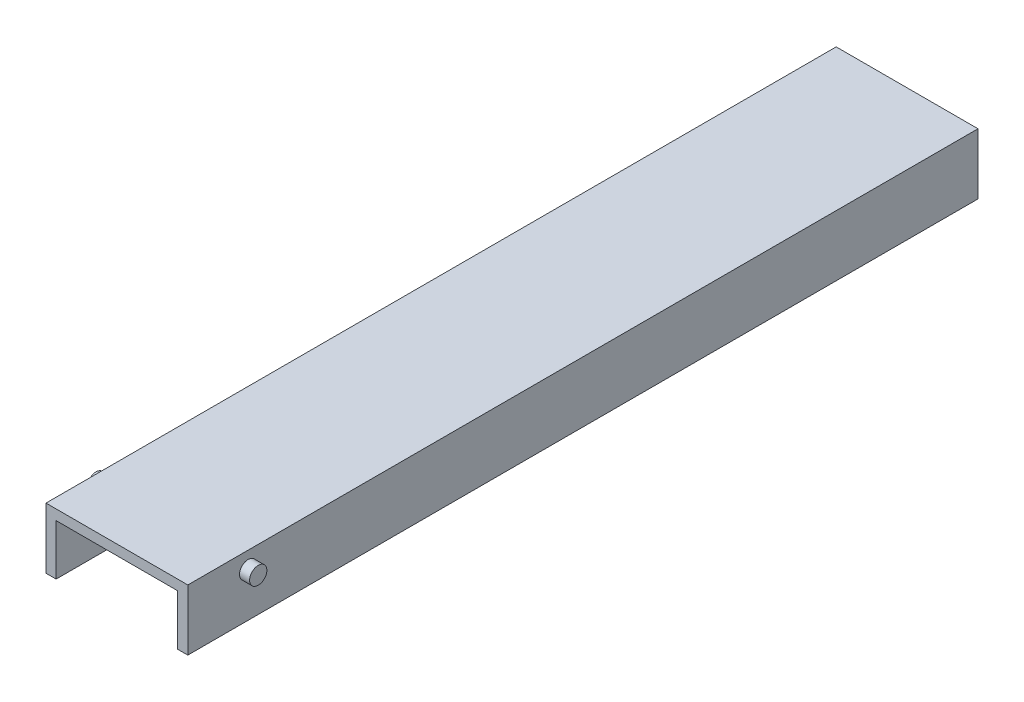
ISO-10303-21;
HEADER;
FILE_DESCRIPTION(('STEP AP214'),'2;1');
FILE_NAME('part.step','',(''),(''),'','','');
FILE_SCHEMA(('AUTOMOTIVE_DESIGN { 1 0 10303 214 1 1 1 1 }'));
ENDSEC;
DATA;
#1=APPLICATION_CONTEXT('core data for automotive mechanical design processes');
#2=APPLICATION_PROTOCOL_DEFINITION('international standard','automotive_design',2000,#1);
#3=PRODUCT_CONTEXT('',#1,'mechanical');
#4=PRODUCT('Part','Part','',(#3));
#5=PRODUCT_RELATED_PRODUCT_CATEGORY('part','',(#4));
#6=PRODUCT_DEFINITION_FORMATION('','',#4);
#7=PRODUCT_DEFINITION_CONTEXT('part definition',#1,'design');
#8=PRODUCT_DEFINITION('design','',#6,#7);
#9=PRODUCT_DEFINITION_SHAPE('','',#8);
#10=(LENGTH_UNIT() NAMED_UNIT(*) SI_UNIT(.MILLI.,.METRE.));
#11=(NAMED_UNIT(*) PLANE_ANGLE_UNIT() SI_UNIT($,.RADIAN.));
#12=(NAMED_UNIT(*) SI_UNIT($,.STERADIAN.) SOLID_ANGLE_UNIT());
#13=UNCERTAINTY_MEASURE_WITH_UNIT(LENGTH_MEASURE(1.E-05),#10,'distance_accuracy_value','');
#14=(GEOMETRIC_REPRESENTATION_CONTEXT(3) GLOBAL_UNCERTAINTY_ASSIGNED_CONTEXT((#13)) GLOBAL_UNIT_ASSIGNED_CONTEXT((#10,
#11,#12)) REPRESENTATION_CONTEXT('',''));
#15=CARTESIAN_POINT('',(0.,0.,0.));
#16=DIRECTION('',(0.,0.,1.));
#17=DIRECTION('',(1.,0.,0.));
#18=AXIS2_PLACEMENT_3D('',#15,#16,#17);
#19=CARTESIAN_POINT('',(0.,0.,0.));
#20=DIRECTION('',(0.,-1.,0.));
#21=DIRECTION('',(0.,0.,-1.));
#22=AXIS2_PLACEMENT_3D('',#19,#20,#21);
#23=PLANE('',#22);
#24=DIRECTION('',(-1.,0.,0.));
#25=VECTOR('',#24,1.);
#26=CARTESIAN_POINT('',(47.5,0.,-86.875));
#27=LINE('',#26,#25);
#28=CARTESIAN_POINT('',(17.5,0.,-86.875));
#29=VERTEX_POINT('',#28);
#30=CARTESIAN_POINT('',(15.,0.,-86.875));
#31=VERTEX_POINT('',#30);
#32=EDGE_CURVE('E149',#29,#31,#27,.T.);
#33=ORIENTED_EDGE('',*,*,#32,.F.);
#34=DIRECTION('',(0.,0.,-1.));
#35=VECTOR('',#34,1.);
#36=CARTESIAN_POINT('',(17.5,0.,97.5));
#37=LINE('',#36,#35);
#38=CARTESIAN_POINT('',(17.5,0.,108.125));
#39=VERTEX_POINT('',#38);
#40=EDGE_CURVE('E112',#39,#29,#37,.T.);
#41=ORIENTED_EDGE('',*,*,#40,.F.);
#42=DIRECTION('',(1.,0.,0.));
#43=VECTOR('',#42,1.);
#44=CARTESIAN_POINT('',(17.5,0.,108.125));
#45=LINE('',#44,#43);
#46=CARTESIAN_POINT('',(15.,0.,108.125));
#47=VERTEX_POINT('',#46);
#48=EDGE_CURVE('E138',#47,#39,#45,.T.);
#49=ORIENTED_EDGE('',*,*,#48,.F.);
#50=DIRECTION('',(0.,0.,1.));
#51=VECTOR('',#50,1.);
#52=CARTESIAN_POINT('',(15.,0.,0.));
#53=LINE('',#52,#51);
#54=EDGE_CURVE('E47',#31,#47,#53,.T.);
#55=ORIENTED_EDGE('',*,*,#54,.F.);
#56=EDGE_LOOP('',(#33,#41,#49,#55));
#57=FACE_BOUND('',#56,.T.);
#58=ADVANCED_FACE('F39',(#57),#23,.T.);
#59=CARTESIAN_POINT('',(17.5,15.,97.5));
#60=DIRECTION('',(-1.,0.,0.));
#61=DIRECTION('',(0.,0.,1.));
#62=AXIS2_PLACEMENT_3D('',#59,#60,#61);
#63=PLANE('',#62);
#64=CARTESIAN_POINT('',(17.5,10.875,93.25));
#65=DIRECTION('',(-1.,0.,0.));
#66=DIRECTION('',(0.,0.,1.));
#67=AXIS2_PLACEMENT_3D('',#64,#65,#66);
#68=CIRCLE('',#67,2.12499999999999);
#69=CARTESIAN_POINT('',(17.5,10.875,95.375));
#70=VERTEX_POINT('',#69);
#71=EDGE_CURVE('E175',#70,#70,#68,.F.);
#72=ORIENTED_EDGE('',*,*,#71,.F.);
#73=EDGE_LOOP('',(#72));
#74=FACE_BOUND('',#73,.T.);
#75=ORIENTED_EDGE('',*,*,#40,.T.);
#76=DIRECTION('',(0.,1.,0.));
#77=VECTOR('',#76,1.);
#78=CARTESIAN_POINT('',(17.5,15.,-86.875));
#79=LINE('',#78,#77);
#80=CARTESIAN_POINT('',(17.5,15.,-86.875));
#81=VERTEX_POINT('',#80);
#82=EDGE_CURVE('E153',#29,#81,#79,.T.);
#83=ORIENTED_EDGE('',*,*,#82,.T.);
#84=DIRECTION('',(0.,0.,-1.));
#85=VECTOR('',#84,1.);
#86=CARTESIAN_POINT('',(17.5,15.,97.5));
#87=LINE('',#86,#85);
#88=CARTESIAN_POINT('',(17.5,15.,108.125));
#89=VERTEX_POINT('',#88);
#90=EDGE_CURVE('E111',#89,#81,#87,.T.);
#91=ORIENTED_EDGE('',*,*,#90,.F.);
#92=DIRECTION('',(0.,1.,0.));
#93=VECTOR('',#92,1.);
#94=CARTESIAN_POINT('',(17.5,15.,108.125));
#95=LINE('',#94,#93);
#96=EDGE_CURVE('E141',#39,#89,#95,.T.);
#97=ORIENTED_EDGE('',*,*,#96,.F.);
#98=EDGE_LOOP('',(#75,#83,#91,#97));
#99=FACE_BOUND('',#98,.T.);
#100=ADVANCED_FACE('F41',(#74,#99),#63,.F.);
#101=CARTESIAN_POINT('',(-17.5,15.,97.5));
#102=DIRECTION('',(1.,0.,0.));
#103=DIRECTION('',(0.,0.,-1.));
#104=AXIS2_PLACEMENT_3D('',#101,#102,#103);
#105=PLANE('',#104);
#106=CARTESIAN_POINT('',(-17.5,10.875,93.25));
#107=DIRECTION('',(1.,0.,0.));
#108=DIRECTION('',(0.,0.,-1.));
#109=AXIS2_PLACEMENT_3D('',#106,#107,#108);
#110=CIRCLE('',#109,2.12499999999999);
#111=CARTESIAN_POINT('',(-17.5,10.875,91.125));
#112=VERTEX_POINT('',#111);
#113=EDGE_CURVE('E170',#112,#112,#110,.F.);
#114=ORIENTED_EDGE('',*,*,#113,.F.);
#115=EDGE_LOOP('',(#114));
#116=FACE_BOUND('',#115,.T.);
#117=DIRECTION('',(0.,0.,1.));
#118=VECTOR('',#117,1.);
#119=CARTESIAN_POINT('',(-17.5,15.,97.5));
#120=LINE('',#119,#118);
#121=CARTESIAN_POINT('',(-17.5,15.,-86.875));
#122=VERTEX_POINT('',#121);
#123=CARTESIAN_POINT('',(-17.5,15.,108.125));
#124=VERTEX_POINT('',#123);
#125=EDGE_CURVE('E168',#122,#124,#120,.T.);
#126=ORIENTED_EDGE('',*,*,#125,.F.);
#127=DIRECTION('',(0.,1.,0.));
#128=VECTOR('',#127,1.);
#129=CARTESIAN_POINT('',(-17.5,15.,-86.875));
#130=LINE('',#129,#128);
#131=CARTESIAN_POINT('',(-17.5,0.,-86.875));
#132=VERTEX_POINT('',#131);
#133=EDGE_CURVE('E108',#132,#122,#130,.T.);
#134=ORIENTED_EDGE('',*,*,#133,.F.);
#135=DIRECTION('',(0.,0.,1.));
#136=VECTOR('',#135,1.);
#137=CARTESIAN_POINT('',(-17.5,0.,97.5));
#138=LINE('',#137,#136);
#139=CARTESIAN_POINT('',(-17.5,0.,108.125));
#140=VERTEX_POINT('',#139);
#141=EDGE_CURVE('E102',#132,#140,#138,.T.);
#142=ORIENTED_EDGE('',*,*,#141,.T.);
#143=DIRECTION('',(0.,-1.,0.));
#144=VECTOR('',#143,1.);
#145=CARTESIAN_POINT('',(-17.5,0.,108.125));
#146=LINE('',#145,#144);
#147=EDGE_CURVE('E107',#124,#140,#146,.T.);
#148=ORIENTED_EDGE('',*,*,#147,.F.);
#149=EDGE_LOOP('',(#126,#134,#142,#148));
#150=FACE_BOUND('',#149,.T.);
#151=ADVANCED_FACE('F105',(#116,#150),#105,.F.);
#152=CARTESIAN_POINT('',(0.,15.,0.));
#153=DIRECTION('',(0.,-1.,0.));
#154=DIRECTION('',(0.,0.,-1.));
#155=AXIS2_PLACEMENT_3D('',#152,#153,#154);
#156=PLANE('',#155);
#157=ORIENTED_EDGE('',*,*,#90,.T.);
#158=DIRECTION('',(-1.,0.,0.));
#159=VECTOR('',#158,1.);
#160=CARTESIAN_POINT('',(47.5,15.,-86.875));
#161=LINE('',#160,#159);
#162=EDGE_CURVE('E146',#81,#122,#161,.T.);
#163=ORIENTED_EDGE('',*,*,#162,.T.);
#164=ORIENTED_EDGE('',*,*,#125,.T.);
#165=DIRECTION('',(-1.,0.,0.));
#166=VECTOR('',#165,1.);
#167=CARTESIAN_POINT('',(-17.5,15.,108.125));
#168=LINE('',#167,#166);
#169=EDGE_CURVE('E128',#89,#124,#168,.T.);
#170=ORIENTED_EDGE('',*,*,#169,.F.);
#171=EDGE_LOOP('',(#157,#163,#164,#170));
#172=FACE_BOUND('',#171,.T.);
#173=ADVANCED_FACE('F190',(#172),#156,.F.);
#174=CARTESIAN_POINT('',(-15.,0.,-86.875));
#175=VERTEX_POINT('',#174);
#176=EDGE_CURVE('E145',#175,#132,#27,.T.);
#177=ORIENTED_EDGE('',*,*,#176,.F.);
#178=DIRECTION('',(0.,0.,-1.));
#179=VECTOR('',#178,1.);
#180=CARTESIAN_POINT('',(-15.,0.,0.));
#181=LINE('',#180,#179);
#182=CARTESIAN_POINT('',(-15.,0.,108.125));
#183=VERTEX_POINT('',#182);
#184=EDGE_CURVE('E118',#183,#175,#181,.T.);
#185=ORIENTED_EDGE('',*,*,#184,.F.);
#186=DIRECTION('',(1.,0.,0.));
#187=VECTOR('',#186,1.);
#188=CARTESIAN_POINT('',(-15.,0.,108.125));
#189=LINE('',#188,#187);
#190=EDGE_CURVE('E115',#140,#183,#189,.T.);
#191=ORIENTED_EDGE('',*,*,#190,.F.);
#192=ORIENTED_EDGE('',*,*,#141,.F.);
#193=EDGE_LOOP('',(#177,#185,#191,#192));
#194=FACE_BOUND('',#193,.T.);
#195=ADVANCED_FACE('F116',(#194),#23,.T.);
#196=CARTESIAN_POINT('',(-20.,10.875,93.25));
#197=DIRECTION('',(1.,0.,0.));
#198=DIRECTION('',(0.,0.,-1.));
#199=AXIS2_PLACEMENT_3D('',#196,#197,#198);
#200=CYLINDRICAL_SURFACE('',#199,2.12499999999999);
#201=CARTESIAN_POINT('',(-20.,10.875,93.25));
#202=DIRECTION('',(-1.,0.,0.));
#203=DIRECTION('',(0.,0.,1.));
#204=AXIS2_PLACEMENT_3D('',#201,#202,#203);
#205=CIRCLE('',#204,2.12499999999999);
#206=CARTESIAN_POINT('',(-20.,10.875,95.375));
#207=VERTEX_POINT('',#206);
#208=EDGE_CURVE('E163',#207,#207,#205,.T.);
#209=ORIENTED_EDGE('',*,*,#208,.F.);
#210=EDGE_LOOP('',(#209));
#211=FACE_BOUND('',#210,.T.);
#212=ORIENTED_EDGE('',*,*,#113,.T.);
#213=EDGE_LOOP('',(#212));
#214=FACE_BOUND('',#213,.T.);
#215=ADVANCED_FACE('F217',(#211,#214),#200,.T.);
#216=CARTESIAN_POINT('',(-20.,0.,0.));
#217=DIRECTION('',(-1.,0.,0.));
#218=DIRECTION('',(0.,0.,1.));
#219=AXIS2_PLACEMENT_3D('',#216,#217,#218);
#220=PLANE('',#219);
#221=ORIENTED_EDGE('',*,*,#208,.T.);
#222=EDGE_LOOP('',(#221));
#223=FACE_BOUND('',#222,.T.);
#224=ADVANCED_FACE('F222',(#223),#220,.T.);
#225=CARTESIAN_POINT('',(20.,10.875,93.25));
#226=DIRECTION('',(-1.,0.,0.));
#227=DIRECTION('',(0.,0.,1.));
#228=AXIS2_PLACEMENT_3D('',#225,#226,#227);
#229=CYLINDRICAL_SURFACE('',#228,2.12499999999999);
#230=CARTESIAN_POINT('',(20.,10.875,93.25));
#231=DIRECTION('',(1.,0.,0.));
#232=DIRECTION('',(0.,0.,-1.));
#233=AXIS2_PLACEMENT_3D('',#230,#231,#232);
#234=CIRCLE('',#233,2.12499999999999);
#235=CARTESIAN_POINT('',(20.,10.875,91.125));
#236=VERTEX_POINT('',#235);
#237=EDGE_CURVE('E159',#236,#236,#234,.T.);
#238=ORIENTED_EDGE('',*,*,#237,.F.);
#239=EDGE_LOOP('',(#238));
#240=FACE_BOUND('',#239,.T.);
#241=ORIENTED_EDGE('',*,*,#71,.T.);
#242=EDGE_LOOP('',(#241));
#243=FACE_BOUND('',#242,.T.);
#244=ADVANCED_FACE('F206',(#240,#243),#229,.T.);
#245=CARTESIAN_POINT('',(20.,10.875,93.25));
#246=DIRECTION('',(1.,0.,0.));
#247=DIRECTION('',(0.,0.,-1.));
#248=AXIS2_PLACEMENT_3D('',#245,#246,#247);
#249=PLANE('',#248);
#250=ORIENTED_EDGE('',*,*,#237,.T.);
#251=EDGE_LOOP('',(#250));
#252=FACE_BOUND('',#251,.T.);
#253=ADVANCED_FACE('F198',(#252),#249,.T.);
#254=CARTESIAN_POINT('',(-15.,12.5,-163.));
#255=DIRECTION('',(0.,1.,0.));
#256=DIRECTION('',(0.,0.,1.));
#257=AXIS2_PLACEMENT_3D('',#254,#255,#256);
#258=PLANE('',#257);
#259=DIRECTION('',(0.,0.,1.));
#260=VECTOR('',#259,1.);
#261=CARTESIAN_POINT('',(-15.,12.5,-163.));
#262=LINE('',#261,#260);
#263=CARTESIAN_POINT('',(-15.,12.5,-86.875));
#264=VERTEX_POINT('',#263);
#265=CARTESIAN_POINT('',(-15.,12.5,108.125));
#266=VERTEX_POINT('',#265);
#267=EDGE_CURVE('E157',#264,#266,#262,.T.);
#268=ORIENTED_EDGE('',*,*,#267,.F.);
#269=DIRECTION('',(1.,0.,0.));
#270=VECTOR('',#269,1.);
#271=CARTESIAN_POINT('',(-15.,12.5,-86.875));
#272=LINE('',#271,#270);
#273=CARTESIAN_POINT('',(15.,12.5,-86.875));
#274=VERTEX_POINT('',#273);
#275=EDGE_CURVE('E54',#264,#274,#272,.T.);
#276=ORIENTED_EDGE('',*,*,#275,.T.);
#277=DIRECTION('',(0.,0.,1.));
#278=VECTOR('',#277,1.);
#279=CARTESIAN_POINT('',(15.,12.5,-163.));
#280=LINE('',#279,#278);
#281=CARTESIAN_POINT('',(15.,12.5,108.125));
#282=VERTEX_POINT('',#281);
#283=EDGE_CURVE('E156',#274,#282,#280,.T.);
#284=ORIENTED_EDGE('',*,*,#283,.T.);
#285=DIRECTION('',(1.,0.,0.));
#286=VECTOR('',#285,1.);
#287=CARTESIAN_POINT('',(15.,12.5,108.125));
#288=LINE('',#287,#286);
#289=EDGE_CURVE('E132',#266,#282,#288,.T.);
#290=ORIENTED_EDGE('',*,*,#289,.F.);
#291=EDGE_LOOP('',(#268,#276,#284,#290));
#292=FACE_BOUND('',#291,.T.);
#293=ADVANCED_FACE('F196',(#292),#258,.F.);
#294=CARTESIAN_POINT('',(15.,-12.5,-163.));
#295=DIRECTION('',(1.,0.,0.));
#296=DIRECTION('',(0.,0.,-1.));
#297=AXIS2_PLACEMENT_3D('',#294,#295,#296);
#298=PLANE('',#297);
#299=ORIENTED_EDGE('',*,*,#283,.F.);
#300=DIRECTION('',(0.,-1.,0.));
#301=VECTOR('',#300,1.);
#302=CARTESIAN_POINT('',(15.,-12.5,-86.875));
#303=LINE('',#302,#301);
#304=EDGE_CURVE('E58',#274,#31,#303,.T.);
#305=ORIENTED_EDGE('',*,*,#304,.T.);
#306=ORIENTED_EDGE('',*,*,#54,.T.);
#307=DIRECTION('',(0.,-1.,0.));
#308=VECTOR('',#307,1.);
#309=CARTESIAN_POINT('',(15.,0.,108.125));
#310=LINE('',#309,#308);
#311=EDGE_CURVE('E135',#282,#47,#310,.T.);
#312=ORIENTED_EDGE('',*,*,#311,.F.);
#313=EDGE_LOOP('',(#299,#305,#306,#312));
#314=FACE_BOUND('',#313,.T.);
#315=ADVANCED_FACE('F182',(#314),#298,.F.);
#316=CARTESIAN_POINT('',(-15.,-12.5,-163.));
#317=DIRECTION('',(-1.,0.,0.));
#318=DIRECTION('',(0.,0.,1.));
#319=AXIS2_PLACEMENT_3D('',#316,#317,#318);
#320=PLANE('',#319);
#321=ORIENTED_EDGE('',*,*,#184,.T.);
#322=DIRECTION('',(0.,1.,0.));
#323=VECTOR('',#322,1.);
#324=CARTESIAN_POINT('',(-15.,-12.5,-86.875));
#325=LINE('',#324,#323);
#326=EDGE_CURVE('E11',#175,#264,#325,.T.);
#327=ORIENTED_EDGE('',*,*,#326,.T.);
#328=ORIENTED_EDGE('',*,*,#267,.T.);
#329=DIRECTION('',(0.,1.,0.));
#330=VECTOR('',#329,1.);
#331=CARTESIAN_POINT('',(-15.,12.5,108.125));
#332=LINE('',#331,#330);
#333=EDGE_CURVE('E122',#183,#266,#332,.T.);
#334=ORIENTED_EDGE('',*,*,#333,.F.);
#335=EDGE_LOOP('',(#321,#327,#328,#334));
#336=FACE_BOUND('',#335,.T.);
#337=ADVANCED_FACE('F193',(#336),#320,.F.);
#338=CARTESIAN_POINT('',(47.5,15.,-86.875));
#339=DIRECTION('',(0.,0.,1.));
#340=DIRECTION('',(1.,0.,0.));
#341=AXIS2_PLACEMENT_3D('',#338,#339,#340);
#342=PLANE('',#341);
#343=ORIENTED_EDGE('',*,*,#32,.T.);
#344=ORIENTED_EDGE('',*,*,#304,.F.);
#345=ORIENTED_EDGE('',*,*,#275,.F.);
#346=ORIENTED_EDGE('',*,*,#326,.F.);
#347=ORIENTED_EDGE('',*,*,#176,.T.);
#348=ORIENTED_EDGE('',*,*,#133,.T.);
#349=ORIENTED_EDGE('',*,*,#162,.F.);
#350=ORIENTED_EDGE('',*,*,#82,.F.);
#351=EDGE_LOOP('',(#343,#344,#345,#346,#347,#348,#349,#350));
#352=FACE_BOUND('',#351,.T.);
#353=ADVANCED_FACE('F191',(#352),#342,.F.);
#354=CARTESIAN_POINT('',(0.,0.,108.125));
#355=DIRECTION('',(0.,0.,-1.));
#356=DIRECTION('',(-1.,0.,0.));
#357=AXIS2_PLACEMENT_3D('',#354,#355,#356);
#358=PLANE('',#357);
#359=ORIENTED_EDGE('',*,*,#147,.T.);
#360=ORIENTED_EDGE('',*,*,#190,.T.);
#361=ORIENTED_EDGE('',*,*,#333,.T.);
#362=ORIENTED_EDGE('',*,*,#289,.T.);
#363=ORIENTED_EDGE('',*,*,#311,.T.);
#364=ORIENTED_EDGE('',*,*,#48,.T.);
#365=ORIENTED_EDGE('',*,*,#96,.T.);
#366=ORIENTED_EDGE('',*,*,#169,.T.);
#367=EDGE_LOOP('',(#359,#360,#361,#362,#363,#364,#365,#366));
#368=FACE_BOUND('',#367,.T.);
#369=ADVANCED_FACE('F125',(#368),#358,.F.);
#370=CLOSED_SHELL('',(#58,#100,#151,#173,#195,#215,#224,#244,#253,#293,#315,#337,#353,#369));
#371=MANIFOLD_SOLID_BREP('B2',#370);
#372=ADVANCED_BREP_SHAPE_REPRESENTATION('',(#18,#371),#14);
#373=SHAPE_DEFINITION_REPRESENTATION(#9,#372);
ENDSEC;
END-ISO-10303-21;
